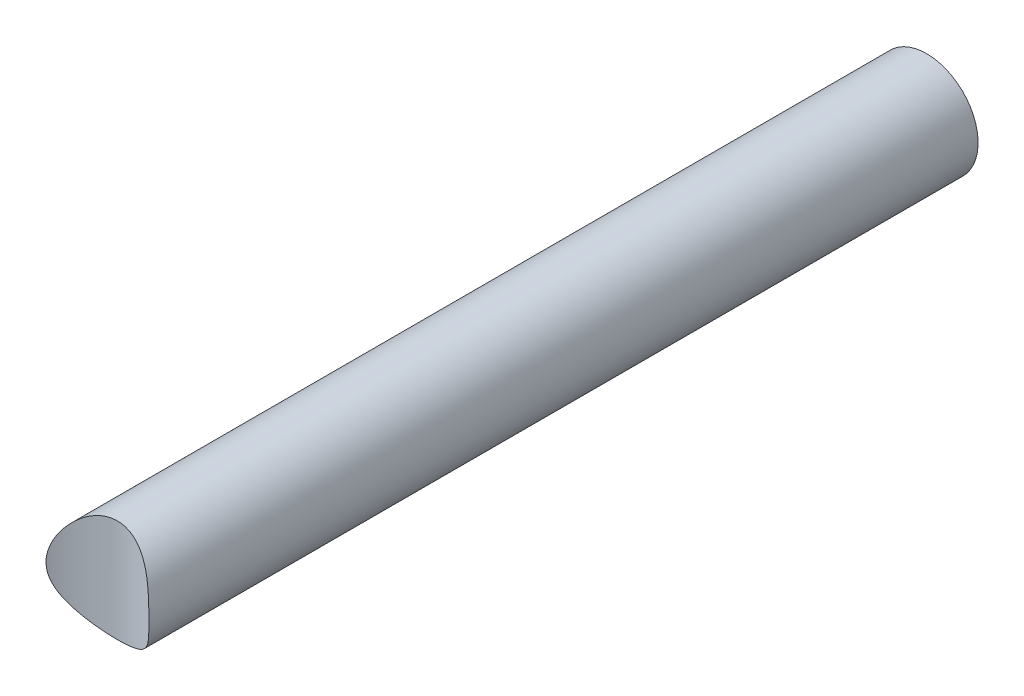
ISO-10303-21;
HEADER;
FILE_DESCRIPTION(('STEP AP214'),'2;1');
FILE_NAME('part.step','',(''),(''),'','','');
FILE_SCHEMA(('AUTOMOTIVE_DESIGN { 1 0 10303 214 1 1 1 1 }'));
ENDSEC;
DATA;
#1=APPLICATION_CONTEXT('core data for automotive mechanical design processes');
#2=APPLICATION_PROTOCOL_DEFINITION('international standard','automotive_design',2000,#1);
#3=PRODUCT_CONTEXT('',#1,'mechanical');
#4=PRODUCT('Part','Part','',(#3));
#5=PRODUCT_RELATED_PRODUCT_CATEGORY('part','',(#4));
#6=PRODUCT_DEFINITION_FORMATION('','',#4);
#7=PRODUCT_DEFINITION_CONTEXT('part definition',#1,'design');
#8=PRODUCT_DEFINITION('design','',#6,#7);
#9=PRODUCT_DEFINITION_SHAPE('','',#8);
#10=(LENGTH_UNIT() NAMED_UNIT(*) SI_UNIT(.MILLI.,.METRE.));
#11=(NAMED_UNIT(*) PLANE_ANGLE_UNIT() SI_UNIT($,.RADIAN.));
#12=(NAMED_UNIT(*) SI_UNIT($,.STERADIAN.) SOLID_ANGLE_UNIT());
#13=UNCERTAINTY_MEASURE_WITH_UNIT(LENGTH_MEASURE(1.E-05),#10,'distance_accuracy_value','');
#14=(GEOMETRIC_REPRESENTATION_CONTEXT(3) GLOBAL_UNCERTAINTY_ASSIGNED_CONTEXT((#13)) GLOBAL_UNIT_ASSIGNED_CONTEXT((#10,
#11,#12)) REPRESENTATION_CONTEXT('',''));
#15=CARTESIAN_POINT('',(0.,0.,0.));
#16=DIRECTION('',(0.,0.,1.));
#17=DIRECTION('',(1.,0.,0.));
#18=AXIS2_PLACEMENT_3D('',#15,#16,#17);
#19=CARTESIAN_POINT('',(120.3546666667,2.083,-37.8));
#20=DIRECTION('',(0.,0.,-1.));
#21=DIRECTION('',(0.,-1.,0.));
#22=AXIS2_PLACEMENT_3D('',#19,#20,#21);
#23=PLANE('',#22);
#24=CARTESIAN_POINT('',(120.3546666667,2.083,-37.8));
#25=DIRECTION('',(0.,0.,-1.));
#26=DIRECTION('',(-1.,0.,0.));
#27=AXIS2_PLACEMENT_3D('',#24,#25,#26);
#28=CIRCLE('',#27,0.83);
#29=CARTESIAN_POINT('',(119.5246666667,2.083,-37.8));
#30=VERTEX_POINT('',#29);
#31=EDGE_CURVE('E11',#30,#30,#28,.T.);
#32=ORIENTED_EDGE('',*,*,#31,.T.);
#33=EDGE_LOOP('',(#32));
#34=FACE_BOUND('',#33,.T.);
#35=ADVANCED_FACE('F17',(#34),#23,.T.);
#36=CARTESIAN_POINT('',(120.3546666667,2.253,-23.51274872028));
#37=DIRECTION('',(0.,-1.,0.));
#38=DIRECTION('',(1.,0.,0.));
#39=AXIS2_PLACEMENT_3D('',#36,#37,#38);
#40=CYLINDRICAL_SURFACE('',#39,1.23);
#41=CARTESIAN_POINT('',(121.1846666667,2.083,-24.4204931777128));
#42=CARTESIAN_POINT('',(121.184662738499,2.08977272284553,-24.4204966828572));
#43=CARTESIAN_POINT('',(121.184577446457,2.09654536498904,-24.4205747534737));
#44=CARTESIAN_POINT('',(121.184244006698,2.1100792903971,-24.4208795093542));
#45=CARTESIAN_POINT('',(121.183995955118,2.11684057800628,-24.4211061068883));
#46=CARTESIAN_POINT('',(121.183336708637,2.13035179430022,-24.4217075473596));
#47=CARTESIAN_POINT('',(121.182925436814,2.13710171612013,-24.4220824601941));
#48=CARTESIAN_POINT('',(121.181939345694,2.150590214289,-24.4229796593548));
#49=CARTESIAN_POINT('',(121.181364276818,2.15732875741656,-24.4235021705677));
#50=CARTESIAN_POINT('',(121.180049917688,2.17079452733234,-24.4246934974464));
#51=CARTESIAN_POINT('',(121.179310207016,2.17752167991123,-24.4253626875939));
#52=CARTESIAN_POINT('',(121.177665662846,2.19096471213866,-24.426846025186));
#53=CARTESIAN_POINT('',(121.176760241325,2.19768046283451,-24.4276606885819));
#54=CARTESIAN_POINT('',(121.174783137237,2.21110074873807,-24.4294333690315));
#55=CARTESIAN_POINT('',(121.173710703525,2.21780508769717,-24.430392033007));
#56=CARTESIAN_POINT('',(121.171398205996,2.23120261817495,-24.4324508472118));
#57=CARTESIAN_POINT('',(121.170157233547,2.23789553505737,-24.4335517626701));
#58=CARTESIAN_POINT('',(121.167506060469,2.2512703063906,-24.4358929492308));
#59=CARTESIAN_POINT('',(121.166094800329,2.2579517984536,-24.437134089398));
#60=CARTESIAN_POINT('',(121.163101233229,2.27130379067885,-24.4397533243569));
#61=CARTESIAN_POINT('',(121.161517723322,2.2779738329543,-24.4411323760827));
#62=CARTESIAN_POINT('',(121.158177608934,2.29130309183655,-24.4440247733977));
#63=CARTESIAN_POINT('',(121.156419666028,2.29796175008215,-24.445539146839));
#64=CARTESIAN_POINT('',(121.152728468084,2.31126807777452,-24.4486992077759));
#65=CARTESIAN_POINT('',(121.150793748001,2.31791508163254,-24.4503459758836));
#66=CARTESIAN_POINT('',(121.144691289875,2.33794452743125,-24.4555052012322));
#67=CARTESIAN_POINT('',(121.140277162902,2.35120839673746,-24.459191325518));
#68=CARTESIAN_POINT('',(121.130720528012,2.37769478782532,-24.4670439851573));
#69=CARTESIAN_POINT('',(121.125563627973,2.39090937369023,-24.4712196048742));
#70=CARTESIAN_POINT('',(121.115043057633,2.41602800089198,-24.479583569273));
#71=CARTESIAN_POINT('',(121.109721660103,2.42795748556284,-24.483748929299));
#72=CARTESIAN_POINT('',(121.098542346908,2.45154715238606,-24.4923399182278));
#73=CARTESIAN_POINT('',(121.092681885353,2.46320569273493,-24.4967667426829));
#74=CARTESIAN_POINT('',(121.080406025537,2.48625237507223,-24.5058555142568));
#75=CARTESIAN_POINT('',(121.073986962102,2.49763799050141,-24.5105189150902));
#76=CARTESIAN_POINT('',(121.060577999467,2.52014022658953,-24.5200507964083));
#77=CARTESIAN_POINT('',(121.053583388331,2.53125340505922,-24.5249207698522));
#78=CARTESIAN_POINT('',(121.03900624686,2.55321152181846,-24.5348337864311));
#79=CARTESIAN_POINT('',(121.031418025326,2.5640520810526,-24.5398781546643));
#80=CARTESIAN_POINT('',(121.015636793318,2.58546601993716,-24.5501049948603));
#81=CARTESIAN_POINT('',(121.00743720713,2.59603409976501,-24.5552884096022));
#82=CARTESIAN_POINT('',(120.990416073295,2.61690361042951,-24.5657558252376));
#83=CARTESIAN_POINT('',(120.981587163958,2.62719885194515,-24.5710401859239));
#84=CARTESIAN_POINT('',(120.963292115017,2.64752494497738,-24.5816681621143));
#85=CARTESIAN_POINT('',(120.95381796552,2.65754880498359,-24.5870113494996));
#86=CARTESIAN_POINT('',(120.934588677857,2.67694789094443,-24.5975104494673));
#87=CARTESIAN_POINT('',(120.92484371534,2.68633234987684,-24.6026679330825));
#88=CARTESIAN_POINT('',(120.904980053891,2.70455319504969,-24.6128297806962));
#89=CARTESIAN_POINT('',(120.894866016134,2.71339409132387,-24.6178351556405));
#90=CARTESIAN_POINT('',(120.874264432493,2.73052966476083,-24.627669060481));
#91=CARTESIAN_POINT('',(120.863780705437,2.73882828266472,-24.6324987171615));
#92=CARTESIAN_POINT('',(120.842439506451,2.75487953679573,-24.64195771765));
#93=CARTESIAN_POINT('',(120.831585001238,2.76263545181617,-24.6465881846424));
#94=CARTESIAN_POINT('',(120.809503447048,2.77760204520171,-24.6556245234637));
#95=CARTESIAN_POINT('',(120.798278511178,2.78481523542845,-24.6600313947175));
#96=CARTESIAN_POINT('',(120.775458424538,2.79869732298529,-24.6685957455851));
#97=CARTESIAN_POINT('',(120.76386456122,2.80536787445077,-24.6727539720243));
#98=CARTESIAN_POINT('',(120.74030977201,2.81816492571915,-24.6807958273364));
#99=CARTESIAN_POINT('',(120.728349363107,2.82429214826165,-24.6846798195513));
#100=CARTESIAN_POINT('',(120.704067303438,2.83600590157503,-24.692147137128));
#101=CARTESIAN_POINT('',(120.69174547889,2.84159216648975,-24.6957303145388));
#102=CARTESIAN_POINT('',(120.666387093487,2.85236694779147,-24.7026682422656));
#103=CARTESIAN_POINT('',(120.653340206667,2.85753793209726,-24.7060125687356));
#104=CARTESIAN_POINT('',(120.627075987281,2.86718124065873,-24.7122791365693));
#105=CARTESIAN_POINT('',(120.613862530485,2.87166114658152,-24.7152059270817));
#106=CARTESIAN_POINT('',(120.587280220924,2.87992591998228,-24.7206283186491));
#107=CARTESIAN_POINT('',(120.57391416412,2.88371717453743,-24.7231278679351));
#108=CARTESIAN_POINT('',(120.547041320558,2.89060516656165,-24.7276875343069));
#109=CARTESIAN_POINT('',(120.533536369877,2.89370695319864,-24.7297508402874));
#110=CARTESIAN_POINT('',(120.506399533117,2.89921771003046,-24.7334303260172));
#111=CARTESIAN_POINT('',(120.492768684955,2.90163023024227,-24.7350487951646));
#112=CARTESIAN_POINT('',(120.472228875234,2.90473218850401,-24.7371368892188));
#113=CARTESIAN_POINT('',(120.465374709358,2.90567923516753,-24.7377757724114));
#114=CARTESIAN_POINT('',(120.451640496507,2.90740109226538,-24.7389393736787));
#115=CARTESIAN_POINT('',(120.444760474644,2.90817603998421,-24.739464182744));
#116=CARTESIAN_POINT('',(120.430976745094,2.90955372622874,-24.7403987046497));
#117=CARTESIAN_POINT('',(120.424073041941,2.91015649604681,-24.7408084384042));
#118=CARTESIAN_POINT('',(120.410243808919,2.91118995726513,-24.7415119750969));
#119=CARTESIAN_POINT('',(120.403318270815,2.91162057319082,-24.7418057271866));
#120=CARTESIAN_POINT('',(120.3894473428,2.91230981437832,-24.7422764799968));
#121=CARTESIAN_POINT('',(120.382501939645,2.91256825745392,-24.7424533570433));
#122=CARTESIAN_POINT('',(120.368593255295,2.91291331200466,-24.742689575667));
#123=CARTESIAN_POINT('',(120.361629963621,2.91299963554009,-24.7427487202886));
#124=CARTESIAN_POINT('',(120.347707179227,2.91300036426052,-24.7427487202714));
#125=CARTESIAN_POINT('',(120.340747686513,2.91291486347198,-24.7426896403279));
#126=CARTESIAN_POINT('',(120.32684609043,2.91257128362434,-24.7424536709928));
#127=CARTESIAN_POINT('',(120.319903977049,2.91231348068793,-24.7422769700963));
#128=CARTESIAN_POINT('',(120.306039115979,2.91162545135795,-24.7418066633514));
#129=CARTESIAN_POINT('',(120.299116355957,2.91119539487272,-24.7415131727045));
#130=CARTESIAN_POINT('',(120.285292164867,2.91016295712168,-24.7408102265283));
#131=CARTESIAN_POINT('',(120.278390726935,2.90956063884394,-24.7404008133869));
#132=CARTESIAN_POINT('',(120.264611012769,2.90818376781963,-24.7394669743169));
#133=CARTESIAN_POINT('',(120.257732742899,2.90740917113509,-24.7389425190483));
#134=CARTESIAN_POINT('',(120.244001518872,2.90568792621624,-24.7377796410188));
#135=CARTESIAN_POINT('',(120.237148592143,2.90474112798057,-24.7371411189052));
#136=CARTESIAN_POINT('',(120.216610967731,2.90163966729536,-24.7350540163569));
#137=CARTESIAN_POINT('',(120.202981071087,2.89922730143483,-24.7334361894852));
#138=CARTESIAN_POINT('',(120.175844089428,2.89371654192984,-24.7297577772557));
#139=CARTESIAN_POINT('',(120.162338071468,2.89061449839544,-24.7276948380707));
#140=CARTESIAN_POINT('',(120.135461062738,2.8837257025674,-24.7231354897407));
#141=CARTESIAN_POINT('',(120.122091942903,2.87993380560741,-24.7206358296641));
#142=CARTESIAN_POINT('',(120.095501553479,2.87166736156609,-24.7152126125652));
#143=CARTESIAN_POINT('',(120.082283119776,2.86718633731265,-24.7122850481405));
#144=CARTESIAN_POINT('',(120.056006913875,2.85754074229906,-24.7060160988243));
#145=CARTESIAN_POINT('',(120.042953059197,2.85236851109655,-24.7026701081394));
#146=CARTESIAN_POINT('',(120.017593941168,2.84159604577007,-24.6957319796713));
#147=CARTESIAN_POINT('',(120.005278007041,2.83601393306274,-24.6921506169506));
#148=CARTESIAN_POINT('',(119.981005982117,2.82430715886902,-24.684686791758));
#149=CARTESIAN_POINT('',(119.969049769744,2.81818268350952,-24.680804432638));
#150=CARTESIAN_POINT('',(119.945501527309,2.80539014056875,-24.672765497149));
#151=CARTESIAN_POINT('',(119.933910071434,2.79872127005203,-24.668608517526));
#152=CARTESIAN_POINT('',(119.911093034364,2.78484146869118,-24.660046160249));
#153=CARTESIAN_POINT('',(119.899868801731,2.77762880486965,-24.6556400006979));
#154=CARTESIAN_POINT('',(119.877786935627,2.76266220624471,-24.6466044308226));
#155=CARTESIAN_POINT('',(119.866931479134,2.75490568362705,-24.641973990832));
#156=CARTESIAN_POINT('',(119.845586708887,2.73885216345449,-24.6325142395137));
#157=CARTESIAN_POINT('',(119.835100427208,2.73055181527664,-24.6276837793465));
#158=CARTESIAN_POINT('',(119.814492180555,2.71341166326474,-24.6178473554977));
#159=CARTESIAN_POINT('',(119.804374100425,2.70456785140144,-24.612840243805));
#160=CARTESIAN_POINT('',(119.784500685166,2.68634029428514,-24.6026737849205));
#161=CARTESIAN_POINT('',(119.774750074665,2.67695197957996,-24.5975134083499));
#162=CARTESIAN_POINT('',(119.755519706507,2.65755458860021,-24.5870137183003));
#163=CARTESIAN_POINT('',(119.746049640224,2.6475367177136,-24.5816729072854));
#164=CARTESIAN_POINT('',(119.727761547234,2.62722078354605,-24.5710492639478));
#165=CARTESIAN_POINT('',(119.718935576592,2.61692965801532,-24.5657668506713));
#166=CARTESIAN_POINT('',(119.701918962942,2.59606681550193,-24.5553026879747));
#167=CARTESIAN_POINT('',(119.693721031642,2.58550122732626,-24.5501205803089));
#168=CARTESIAN_POINT('',(119.677941853983,2.56409064539771,-24.5398956388997));
#169=CARTESIAN_POINT('',(119.670354108204,2.55325089050909,-24.5348518723945));
#170=CARTESIAN_POINT('',(119.655776703293,2.53129277105377,-24.5249392520898));
#171=CARTESIAN_POINT('',(119.648781432194,2.52017872445202,-24.5200690918448));
#172=CARTESIAN_POINT('',(119.635369967833,2.4976731477388,-24.5105359423938));
#173=CARTESIAN_POINT('',(119.628949143689,2.48628500027049,-24.5058714868795));
#174=CARTESIAN_POINT('',(119.616668686102,2.46323160396364,-24.4967796975812));
#175=CARTESIAN_POINT('',(119.610805468621,2.4515688254365,-24.4923509433311));
#176=CARTESIAN_POINT('',(119.599619372468,2.42796919360604,-24.4837549491886));
#177=CARTESIAN_POINT('',(119.594294028877,2.41603392966434,-24.4795865531788));
#178=CARTESIAN_POINT('',(119.583769790401,2.39091284380543,-24.4712196722745));
#179=CARTESIAN_POINT('',(119.578612743015,2.37770182914182,-24.4670439322921));
#180=CARTESIAN_POINT('',(119.569055995628,2.35122145857888,-24.4591911834055));
#181=CARTESIAN_POINT('',(119.564641926565,2.33796002850214,-24.4555051028346));
#182=CARTESIAN_POINT('',(119.558539571431,2.31793385513176,-24.4503459638363));
#183=CARTESIAN_POINT('',(119.556604850291,2.31128772150548,-24.4486991947826));
#184=CARTESIAN_POINT('',(119.55291365021,2.29798288454599,-24.445539132276));
#185=CARTESIAN_POINT('',(119.551155710613,2.29132484490519,-24.4440247613848));
#186=CARTESIAN_POINT('',(119.547815597,2.27799657766642,-24.4411323647739));
#187=CARTESIAN_POINT('',(119.546232089314,2.27132690649289,-24.4397533148085));
#188=CARTESIAN_POINT('',(119.543238521957,2.2579754098176,-24.4371340797219));
#189=CARTESIAN_POINT('',(119.541827264378,2.2512940403071,-24.4358929416439));
#190=CARTESIAN_POINT('',(119.539176091055,2.2379192676689,-24.4335517549353));
#191=CARTESIAN_POINT('',(119.537935121111,2.23122622511405,-24.4324508415774));
#192=CARTESIAN_POINT('',(119.535622623067,2.21782819671084,-24.4303920269779));
#193=CARTESIAN_POINT('',(119.534550191884,2.21112348381192,-24.4294333651693));
#194=CARTESIAN_POINT('',(119.532573087075,2.19770220332965,-24.4276606841245));
#195=CARTESIAN_POINT('',(119.531667668054,2.19098583047828,-24.4268460229115));
#196=CARTESIAN_POINT('',(119.530023122928,2.17754130705077,-24.4253626844961));
#197=CARTESIAN_POINT('',(119.529283414704,2.1708132841181,-24.4246934965194));
#198=CARTESIAN_POINT('',(119.527969054373,2.15734552639882,-24.4235021685787));
#199=CARTESIAN_POINT('',(119.527393987856,2.15060586474971,-24.4229796594837));
#200=CARTESIAN_POINT('',(119.526407895277,2.13711488215804,-24.4220824590109));
#201=CARTESIAN_POINT('',(119.525996625696,2.13036359362405,-24.4217075482062));
#202=CARTESIAN_POINT('',(119.525337377463,2.11684939639169,-24.4211061061457));
#203=CARTESIAN_POINT('',(119.525089327947,2.1100864940161,-24.4208795104962));
#204=CARTESIAN_POINT('',(119.524755886186,2.09654909078162,-24.4205747527765));
#205=CARTESIAN_POINT('',(119.524670596072,2.08977458530829,-24.4204966839058));
#206=CARTESIAN_POINT('',(119.5246666667,2.083,-24.4204931777128));
#207=B_SPLINE_CURVE_WITH_KNOTS('',3,(#41,#42,#43,#44,#45,#46,#47,#48,#49,#50,#51,#52,#53,#54,
#55,#56,#57,#58,#59,#60,#61,#62,#63,#64,#65,#66,#67,#68,#69,#70,#71,#72,#73,#74,#75,#76,#77,#78,
#79,#80,#81,#82,#83,#84,#85,#86,#87,#88,#89,#90,#91,#92,#93,#94,#95,#96,#97,#98,#99,#100,#101,
#102,#103,#104,#105,#106,#107,#108,#109,#110,#111,#112,#113,#114,#115,#116,#117,#118,#119,#120,
#121,#122,#123,#124,#125,#126,#127,#128,#129,#130,#131,#132,#133,#134,#135,#136,#137,#138,#139,
#140,#141,#142,#143,#144,#145,#146,#147,#148,#149,#150,#151,#152,#153,#154,#155,#156,#157,#158,
#159,#160,#161,#162,#163,#164,#165,#166,#167,#168,#169,#170,#171,#172,#173,#174,#175,#176,#177,
#178,#179,#180,#181,#182,#183,#184,#185,#186,#187,#188,#189,#190,#191,#192,#193,#194,#195,#196,
#197,#198,#199,#200,#201,#202,#203,#204,#205,#206),.UNSPECIFIED.,.F.,.F.,(4,2,2,2,2,2,2,2,2,2,2,
2,2,2,2,2,2,2,2,2,2,2,2,2,2,2,2,2,2,2,2,2,2,2,2,2,2,2,2,2,2,2,2,2,2,2,2,2,2,2,2,2,2,2,2,2,2,2,2,
2,2,2,2,2,2,2,2,2,2,2,2,2,2,2,2,2,2,2,2,2,2,2,4),(0.,0.0203172853947014,0.0406225808535559,
0.060937457116471,0.0812834544382331,0.101682014466497,0.122154413671048,0.142721699336396,
0.163404629038327,0.184223614404138,0.205198669813736,0.226349366542171,0.247694792682665,
0.291039092766685,0.335378203066301,0.376494561848875,0.417816190621598,0.459433004042605,
0.501433019015405,0.543901867837868,0.586922381025704,0.630574246468799,0.674933747228603,
0.718355386924577,0.761346686602344,0.80397941646222,0.846327169590175,0.888465031966945,
0.930469214920417,0.972416658137142,1.01438461309596,1.05764416668843,1.10038894094382,
1.14271439750266,1.18471885699166,1.22650290607635,1.24734649599199,1.26817339862882,
1.2889965136816,1.309828747881,1.3306829910261,1.35157209217348,1.37244976540725,
1.39329406110927,1.41411784674326,1.43493402780773,1.45575552394157,1.4765952448985,
1.51837619412612,1.56038375350438,1.60271848773035,1.64547865318719,1.6887596089183,
1.73070563695952,1.77263732542325,1.81463201737992,1.85676670921526,1.89911763399629,
1.94175986535379,1.98476695166493,2.02821058852624,2.07254748625292,2.11618312944701,
2.1591938787937,2.20165946866879,2.24366274059715,2.28528929868091,2.32662708958899,
2.36776591402338,2.41209569230184,2.45543315053074,2.47677613920685,2.49792507590068,
2.51889906465697,2.53971769120552,2.56040098268957,2.58096936162698,2.60144359444869,
2.62184473512044,2.64219406450974,2.66251302630188,2.68282316038859,2.70314603474326),.UNSPECIFIED.);
#208=CARTESIAN_POINT('',(121.1846666667,2.083,-24.42049317771));
#209=VERTEX_POINT('',#208);
#210=CARTESIAN_POINT('',(119.5246666667,2.083,-24.4204931777128));
#211=VERTEX_POINT('',#210);
#212=EDGE_CURVE('E55',#209,#211,#207,.T.);
#213=ORIENTED_EDGE('',*,*,#212,.T.);
#214=CARTESIAN_POINT('',(119.5246666667,2.083,-24.4204931777128));
#215=CARTESIAN_POINT('',(119.524670594901,2.07622727715387,-24.4204966828573));
#216=CARTESIAN_POINT('',(119.524755886943,2.06945463500977,-24.4205747534739));
#217=CARTESIAN_POINT('',(119.525089326702,2.05592070960061,-24.4208795093546));
#218=CARTESIAN_POINT('',(119.525337378283,2.04915942199092,-24.4211061068889));
#219=CARTESIAN_POINT('',(119.525996624764,2.03564820569603,-24.4217075473603));
#220=CARTESIAN_POINT('',(119.526407896587,2.02889828387569,-24.4220824601949));
#221=CARTESIAN_POINT('',(119.527393987707,2.01540978570603,-24.4229796593558));
#222=CARTESIAN_POINT('',(119.527969056583,2.00867124257811,-24.4235021705688));
#223=CARTESIAN_POINT('',(119.529283415713,1.99520547266171,-24.4246934974475));
#224=CARTESIAN_POINT('',(119.530023126385,1.98847832008254,-24.425362687595));
#225=CARTESIAN_POINT('',(119.531667670555,1.97503528785463,-24.4268460251873));
#226=CARTESIAN_POINT('',(119.532573092076,1.96831953715859,-24.4276606885833));
#227=CARTESIAN_POINT('',(119.534550196165,1.95489925125472,-24.4294333690328));
#228=CARTESIAN_POINT('',(119.535622629876,1.9481949122955,-24.4303920330084));
#229=CARTESIAN_POINT('',(119.537935127405,1.93479738181756,-24.4324508472132));
#230=CARTESIAN_POINT('',(119.539176099854,1.9281044649351,-24.4335517626716));
#231=CARTESIAN_POINT('',(119.541827272932,1.91472969360186,-24.4358929492322));
#232=CARTESIAN_POINT('',(119.543238533072,1.90804820153891,-24.4371340893994));
#233=CARTESIAN_POINT('',(119.546232100173,1.89469620931382,-24.4397533243582));
#234=CARTESIAN_POINT('',(119.54781561008,1.88802616703848,-24.4411323760841));
#235=CARTESIAN_POINT('',(119.551155724468,1.87469690815654,-24.4440247733989));
#236=CARTESIAN_POINT('',(119.552913667374,1.86803824991114,-24.4455391468402));
#237=CARTESIAN_POINT('',(119.556604865317,1.85473192221925,-24.448699207777));
#238=CARTESIAN_POINT('',(119.5585395854,1.84808491836151,-24.4503459758847));
#239=CARTESIAN_POINT('',(119.564642043527,1.82805547256385,-24.4555052012331));
#240=CARTESIAN_POINT('',(119.569056170499,1.81479160325842,-24.4591913255187));
#241=CARTESIAN_POINT('',(119.578612805389,1.78830521217245,-24.4670439851577));
#242=CARTESIAN_POINT('',(119.583769705428,1.77509062630866,-24.4712196048744));
#243=CARTESIAN_POINT('',(119.594290275767,1.74997199910848,-24.479583569273));
#244=CARTESIAN_POINT('',(119.599611673297,1.7380425144381,-24.483748929299));
#245=CARTESIAN_POINT('',(119.610790986492,1.71445284761568,-24.4923399182279));
#246=CARTESIAN_POINT('',(119.616651448047,1.70279430726715,-24.496766742683));
#247=CARTESIAN_POINT('',(119.628927307863,1.67974762493039,-24.5058555142568));
#248=CARTESIAN_POINT('',(119.635346371298,1.6683620095014,-24.5105189150902));
#249=CARTESIAN_POINT('',(119.648755333933,1.64585977341355,-24.5200507964084));
#250=CARTESIAN_POINT('',(119.655749945069,1.63474659494394,-24.5249207698522));
#251=CARTESIAN_POINT('',(119.67032708654,1.61278847818469,-24.5348337864311));
#252=CARTESIAN_POINT('',(119.677915308074,1.60194791895049,-24.5398781546644));
#253=CARTESIAN_POINT('',(119.693696540083,1.58053398006567,-24.5501049948603));
#254=CARTESIAN_POINT('',(119.70189612627,1.56996590023761,-24.5552884096023));
#255=CARTESIAN_POINT('',(119.718917260105,1.54909638957259,-24.5657558252377));
#256=CARTESIAN_POINT('',(119.727746169442,1.53880114805663,-24.5710401859239));
#257=CARTESIAN_POINT('',(119.746041218383,1.51847505502357,-24.5816681621143));
#258=CARTESIAN_POINT('',(119.75551536788,1.50845119501686,-24.5870113494996));
#259=CARTESIAN_POINT('',(119.774744655541,1.48905210905742,-24.5975104494661));
#260=CARTESIAN_POINT('',(119.784489618056,1.47966765012681,-24.60266793308));
#261=CARTESIAN_POINT('',(119.8043532795,1.46144680495705,-24.6128297806919));
#262=CARTESIAN_POINT('',(119.814467317256,1.4526059086842,-24.6178351556355));
#263=CARTESIAN_POINT('',(119.835068900894,1.43547033524933,-24.6276690604749));
#264=CARTESIAN_POINT('',(119.845552627949,1.42717171734624,-24.6324987171551));
#265=CARTESIAN_POINT('',(119.866893826933,1.41112046321626,-24.6419577176433));
#266=CARTESIAN_POINT('',(119.877748332146,1.40336454819609,-24.6465881846357));
#267=CARTESIAN_POINT('',(119.899829886336,1.38839795481056,-24.6556245234573));
#268=CARTESIAN_POINT('',(119.911054822206,1.38118476458358,-24.6600313947114));
#269=CARTESIAN_POINT('',(119.933874908848,1.36730267702569,-24.6685957455798));
#270=CARTESIAN_POINT('',(119.945468772167,1.36063212555945,-24.6727539720196));
#271=CARTESIAN_POINT('',(119.969023561379,1.34783507428899,-24.6807958273328));
#272=CARTESIAN_POINT('',(119.980983970284,1.34170785174523,-24.6846798195485));
#273=CARTESIAN_POINT('',(120.005266029957,1.32999409842867,-24.6921471371265));
#274=CARTESIAN_POINT('',(120.017587854507,1.32440783351205,-24.6957303145381));
#275=CARTESIAN_POINT('',(120.042946239911,1.31363305220856,-24.7026682422651));
#276=CARTESIAN_POINT('',(120.05599312673,1.3084620679027,-24.7060125687346));
#277=CARTESIAN_POINT('',(120.082257346112,1.29881875934115,-24.7122791365677));
#278=CARTESIAN_POINT('',(120.095470802906,1.2943388534184,-24.7152059270799));
#279=CARTESIAN_POINT('',(120.122053112466,1.28607408001766,-24.7206283186471));
#280=CARTESIAN_POINT('',(120.135419169268,1.28228282546251,-24.723127867933));
#281=CARTESIAN_POINT('',(120.16229201283,1.27539483343829,-24.7276875343049));
#282=CARTESIAN_POINT('',(120.17579696351,1.27229304680131,-24.7297508402855));
#283=CARTESIAN_POINT('',(120.20293380027,1.26678228996949,-24.7334303260156));
#284=CARTESIAN_POINT('',(120.216564648432,1.26436976975769,-24.7350487951632));
#285=CARTESIAN_POINT('',(120.237104458154,1.26126781149599,-24.7371368892177));
#286=CARTESIAN_POINT('',(120.24395862403,1.26032076483247,-24.7377757724104));
#287=CARTESIAN_POINT('',(120.257692836882,1.25859890773461,-24.7389393736779));
#288=CARTESIAN_POINT('',(120.264572858745,1.25782396001579,-24.7394641827433));
#289=CARTESIAN_POINT('',(120.278356588297,1.25644627377125,-24.7403987046491));
#290=CARTESIAN_POINT('',(120.28526029145,1.25584350395318,-24.7408084384037));
#291=CARTESIAN_POINT('',(120.299089524473,1.25481004273486,-24.7415119750966));
#292=CARTESIAN_POINT('',(120.306015062578,1.25437942680918,-24.7418057271863));
#293=CARTESIAN_POINT('',(120.319885990595,1.25369018562168,-24.7422764799967));
#294=CARTESIAN_POINT('',(120.326831393751,1.25343174254608,-24.7424533570433));
#295=CARTESIAN_POINT('',(120.340740078103,1.25308668799534,-24.742689575667));
#296=CARTESIAN_POINT('',(120.347703369778,1.25300036445991,-24.7427487202886));
#297=CARTESIAN_POINT('',(120.361626154175,1.25299963573947,-24.7427487202714));
#298=CARTESIAN_POINT('',(120.368585646891,1.25308513652802,-24.7426896403279));
#299=CARTESIAN_POINT('',(120.382487242978,1.25342871637566,-24.7424536709926));
#300=CARTESIAN_POINT('',(120.38942935636,1.25368651931206,-24.7422769700961));
#301=CARTESIAN_POINT('',(120.403294217433,1.25437454864204,-24.7418066633509));
#302=CARTESIAN_POINT('',(120.410216977458,1.25480460512727,-24.7415131727038));
#303=CARTESIAN_POINT('',(120.42404116855,1.25583704287831,-24.7408102265273));
#304=CARTESIAN_POINT('',(120.430942606483,1.25643936115605,-24.7404008133858));
#305=CARTESIAN_POINT('',(120.444722320652,1.25781623218035,-24.7394669743154));
#306=CARTESIAN_POINT('',(120.451600590522,1.25859082886489,-24.7389425190466));
#307=CARTESIAN_POINT('',(120.465331814551,1.26031207378374,-24.7377796410167));
#308=CARTESIAN_POINT('',(120.472184741281,1.2612588720194,-24.737141118903));
#309=CARTESIAN_POINT('',(120.492722365694,1.26436033270455,-24.7350540163541));
#310=CARTESIAN_POINT('',(120.506352262338,1.26677269856506,-24.7334361894821));
#311=CARTESIAN_POINT('',(120.533489243997,1.27228345807005,-24.7297577772519));
#312=CARTESIAN_POINT('',(120.546995261957,1.27538550160443,-24.7276948380668));
#313=CARTESIAN_POINT('',(120.573872270685,1.28227429743247,-24.7231354897366));
#314=CARTESIAN_POINT('',(120.587241390518,1.28606619439245,-24.7206358296601));
#315=CARTESIAN_POINT('',(120.613831779937,1.29433263843375,-24.7152126125616));
#316=CARTESIAN_POINT('',(120.627050213638,1.29881366268713,-24.7122850481373));
#317=CARTESIAN_POINT('',(120.653326419533,1.30845925770084,-24.7060160988224));
#318=CARTESIAN_POINT('',(120.666380274206,1.31363148890349,-24.7026701081383));
#319=CARTESIAN_POINT('',(120.691739392235,1.32440395423262,-24.6957319796706));
#320=CARTESIAN_POINT('',(120.704055326364,1.32998606694275,-24.692150616949));
#321=CARTESIAN_POINT('',(120.728327351293,1.34169284114119,-24.6846867917548));
#322=CARTESIAN_POINT('',(120.740283563668,1.34781731650255,-24.680804432634));
#323=CARTESIAN_POINT('',(120.763831806106,1.36060985944637,-24.6727654971437));
#324=CARTESIAN_POINT('',(120.775423261983,1.36727872996423,-24.66860851752));
#325=CARTESIAN_POINT('',(120.798240299054,1.38115853132661,-24.6600461602421));
#326=CARTESIAN_POINT('',(120.809464531687,1.38837119514851,-24.6556400006907));
#327=CARTESIAN_POINT('',(120.831546397791,1.40333779377343,-24.6466044308151));
#328=CARTESIAN_POINT('',(120.842401854284,1.4110943163907,-24.6419739908245));
#329=CARTESIAN_POINT('',(120.863746624528,1.42714783656171,-24.6325142395065));
#330=CARTESIAN_POINT('',(120.874232906206,1.43544818473839,-24.6276837793397));
#331=CARTESIAN_POINT('',(120.894841152857,1.45258833674722,-24.6178473554921));
#332=CARTESIAN_POINT('',(120.904959232984,1.46143214860858,-24.6128402438001));
#333=CARTESIAN_POINT('',(120.92483264824,1.47965970572026,-24.6026737849178));
#334=CARTESIAN_POINT('',(120.934583258738,1.48904802042272,-24.5975134083485));
#335=CARTESIAN_POINT('',(120.95381362689,1.50844541139634,-24.5870137183021));
#336=CARTESIAN_POINT('',(120.96328369317,1.51846328227951,-24.5816729072891));
#337=CARTESIAN_POINT('',(120.981571786154,1.53877921644112,-24.5710492639549));
#338=CARTESIAN_POINT('',(120.990397756794,1.54907034196941,-24.5657668506799));
#339=CARTESIAN_POINT('',(121.00741437044,1.56993318447886,-24.5553026879858));
#340=CARTESIAN_POINT('',(121.015612301739,1.58049877265306,-24.550120580321));
#341=CARTESIAN_POINT('',(121.031391479396,1.60190935457964,-24.5398956389134));
#342=CARTESIAN_POINT('',(121.038979225175,1.61274910946778,-24.5348518724086));
#343=CARTESIAN_POINT('',(121.053556630086,1.63470722892309,-24.5249392521043));
#344=CARTESIAN_POINT('',(121.060551901186,1.64582127552536,-24.520069091859));
#345=CARTESIAN_POINT('',(121.073963365548,1.66832685224054,-24.5105359424071));
#346=CARTESIAN_POINT('',(121.080384189694,1.67971499971034,-24.505871486892));
#347=CARTESIAN_POINT('',(121.092664647284,1.70276839602115,-24.4967796975914));
#348=CARTESIAN_POINT('',(121.098527864768,1.71443117455079,-24.4923509433398));
#349=CARTESIAN_POINT('',(121.109713960926,1.7380308063871,-24.4837549491933));
#350=CARTESIAN_POINT('',(121.11503930452,1.74996607033217,-24.4795865531811));
#351=CARTESIAN_POINT('',(121.125563542999,1.77508715619116,-24.4712196722744));
#352=CARTESIAN_POINT('',(121.130720590385,1.78829817085132,-24.4670439322917));
#353=CARTESIAN_POINT('',(121.140277337773,1.81477854140842,-24.4591911834047));
#354=CARTESIAN_POINT('',(121.144691406836,1.82803997148278,-24.4555051028337));
#355=CARTESIAN_POINT('',(121.15079376197,1.84806614484999,-24.4503459638353));
#356=CARTESIAN_POINT('',(121.15272848311,1.85471227847542,-24.4486991947815));
#357=CARTESIAN_POINT('',(121.156419683191,1.86801711543347,-24.4455391322748));
#358=CARTESIAN_POINT('',(121.158177622789,1.87467515507367,-24.4440247613836));
#359=CARTESIAN_POINT('',(121.161517736401,1.88800342231148,-24.4411323647727));
#360=CARTESIAN_POINT('',(121.163101244088,1.89467309348464,-24.4397533148073));
#361=CARTESIAN_POINT('',(121.166094811445,1.90802459015945,-24.4371340797206));
#362=CARTESIAN_POINT('',(121.167506069023,1.91470595966983,-24.4358929416426));
#363=CARTESIAN_POINT('',(121.170157242347,1.92808073230803,-24.433551754934));
#364=CARTESIAN_POINT('',(121.17139821229,1.93477377486301,-24.4324508415761));
#365=CARTESIAN_POINT('',(121.173710710334,1.9481718032667,-24.4303920269766));
#366=CARTESIAN_POINT('',(121.174783141518,1.95487651616599,-24.4294333651681));
#367=CARTESIAN_POINT('',(121.176760246326,1.96829779664922,-24.4276606841233));
#368=CARTESIAN_POINT('',(121.177665665347,1.9750141695012,-24.4268460229104));
#369=CARTESIAN_POINT('',(121.179310210473,1.98845869293015,-24.425362684495));
#370=CARTESIAN_POINT('',(121.180049918698,1.99518671586367,-24.4246934965184));
#371=CARTESIAN_POINT('',(121.181364279028,2.00865447358488,-24.4235021685778));
#372=CARTESIAN_POINT('',(121.181939345545,2.01539413523508,-24.4229796594828));
#373=CARTESIAN_POINT('',(121.182925438124,2.02888511782916,-24.4220824590101));
#374=CARTESIAN_POINT('',(121.183336707705,2.03563640636448,-24.4217075482055));
#375=CARTESIAN_POINT('',(121.183995955937,2.04915060359974,-24.4211061061452));
#376=CARTESIAN_POINT('',(121.184244005454,2.0559135059769,-24.4208795104958));
#377=CARTESIAN_POINT('',(121.184577447214,2.06945090921476,-24.4205747527763));
#378=CARTESIAN_POINT('',(121.184662737328,2.0762254146899,-24.4204966839057));
#379=CARTESIAN_POINT('',(121.1846666667,2.083,-24.4204931777128));
#380=B_SPLINE_CURVE_WITH_KNOTS('',3,(#214,#215,#216,#217,#218,#219,#220,#221,#222,#223,#224,
#225,#226,#227,#228,#229,#230,#231,#232,#233,#234,#235,#236,#237,#238,#239,#240,#241,#242,#243,
#244,#245,#246,#247,#248,#249,#250,#251,#252,#253,#254,#255,#256,#257,#258,#259,#260,#261,#262,
#263,#264,#265,#266,#267,#268,#269,#270,#271,#272,#273,#274,#275,#276,#277,#278,#279,#280,#281,
#282,#283,#284,#285,#286,#287,#288,#289,#290,#291,#292,#293,#294,#295,#296,#297,#298,#299,#300,
#301,#302,#303,#304,#305,#306,#307,#308,#309,#310,#311,#312,#313,#314,#315,#316,#317,#318,#319,
#320,#321,#322,#323,#324,#325,#326,#327,#328,#329,#330,#331,#332,#333,#334,#335,#336,#337,#338,
#339,#340,#341,#342,#343,#344,#345,#346,#347,#348,#349,#350,#351,#352,#353,#354,#355,#356,#357,
#358,#359,#360,#361,#362,#363,#364,#365,#366,#367,#368,#369,#370,#371,#372,#373,#374,#375,#376,
#377,#378,#379),.UNSPECIFIED.,.F.,.F.,(4,2,2,2,2,2,2,2,2,2,2,2,2,2,2,2,2,2,2,2,2,2,2,2,2,2,2,2,
2,2,2,2,2,2,2,2,2,2,2,2,2,2,2,2,2,2,2,2,2,2,2,2,2,2,2,2,2,2,2,2,2,2,2,2,2,2,2,2,2,2,2,2,2,2,2,2,
2,2,2,2,2,2,4),(0.,0.0203172853964835,0.0406225808568955,0.060937457121137,0.0812834544439912,
0.101682014473109,0.12215441367827,0.142721699343987,0.163404629046038,0.18422361441173,
0.205198669820959,0.22634936654878,0.24769479268842,0.29103909277,0.335378203066242,
0.37649456184761,0.417816190619491,0.459433004040013,0.501433019012654,0.543901867835271,
0.586922381023538,0.630574246467326,0.674933747228064,0.718355386914592,0.761346686585588,
0.803979416441408,0.846327169567991,0.888465031946112,0.930469214903629,0.972416658127039,
1.01438461309513,1.05764416668217,1.1003889409336,1.14271439749006,1.18471885697825,
1.22650290606374,1.2473464959804,1.26817339861869,1.28899651367333,1.30982874787503,
1.33068299102281,1.35157209217331,1.37244976541318,1.39329406112049,1.41411784675896,
1.43493402782707,1.45575552396375,1.47659524492269,1.51837619415192,1.56038375352859,
1.60271848774985,1.64547865319897,1.68875960891946,1.73070563697188,1.77263732544373,
1.81463201740532,1.85676670924232,1.89911763402168,1.94175986537413,1.98476695167682,
2.02821058852627,2.07254748623763,2.11618312942077,2.15919387876092,2.20165946863384,
2.24366274056435,2.28528929865452,2.32662708957318,2.36776591402215,2.41209569229192,
2.45543315051441,2.47677613918823,2.4979250758804,2.51889906463568,2.53971769118388,
2.56040098266828,2.58096936160673,2.6014435944302,2.62184473510442,2.64219406449693,
2.66251302629301,2.68282316038441,2.7031460347445),.UNSPECIFIED.);
#381=EDGE_CURVE('E52',#211,#209,#380,.T.);
#382=ORIENTED_EDGE('',*,*,#381,.T.);
#383=EDGE_LOOP('',(#213,#382));
#384=FACE_BOUND('',#383,.T.);
#385=ADVANCED_FACE('F54',(#384),#40,.F.);
#386=CARTESIAN_POINT('',(120.3546666667,2.083,-29.85637436014));
#387=DIRECTION('',(0.,0.,1.));
#388=DIRECTION('',(1.,0.,0.));
#389=AXIS2_PLACEMENT_3D('',#386,#387,#388);
#390=CYLINDRICAL_SURFACE('',#389,0.83);
#391=ORIENTED_EDGE('',*,*,#212,.F.);
#392=ORIENTED_EDGE('',*,*,#381,.F.);
#393=DIRECTION('',(0.,0.,-1.));
#394=VECTOR('',#393,1.);
#395=CARTESIAN_POINT('',(119.5246666667,2.083,-29.85637436014));
#396=LINE('',#395,#394);
#397=EDGE_CURVE('E28',#211,#30,#396,.T.);
#398=ORIENTED_EDGE('',*,*,#397,.T.);
#399=ORIENTED_EDGE('',*,*,#31,.F.);
#400=ORIENTED_EDGE('',*,*,#397,.F.);
#401=EDGE_LOOP('',(#391,#392,#398,#399,#400));
#402=FACE_BOUND('',#401,.T.);
#403=ADVANCED_FACE('F60',(#402),#390,.T.);
#404=CLOSED_SHELL('',(#35,#385,#403));
#405=MANIFOLD_SOLID_BREP('B1',#404);
#406=ADVANCED_BREP_SHAPE_REPRESENTATION('',(#18,#405),#14);
#407=SHAPE_DEFINITION_REPRESENTATION(#9,#406);
ENDSEC;
END-ISO-10303-21;
